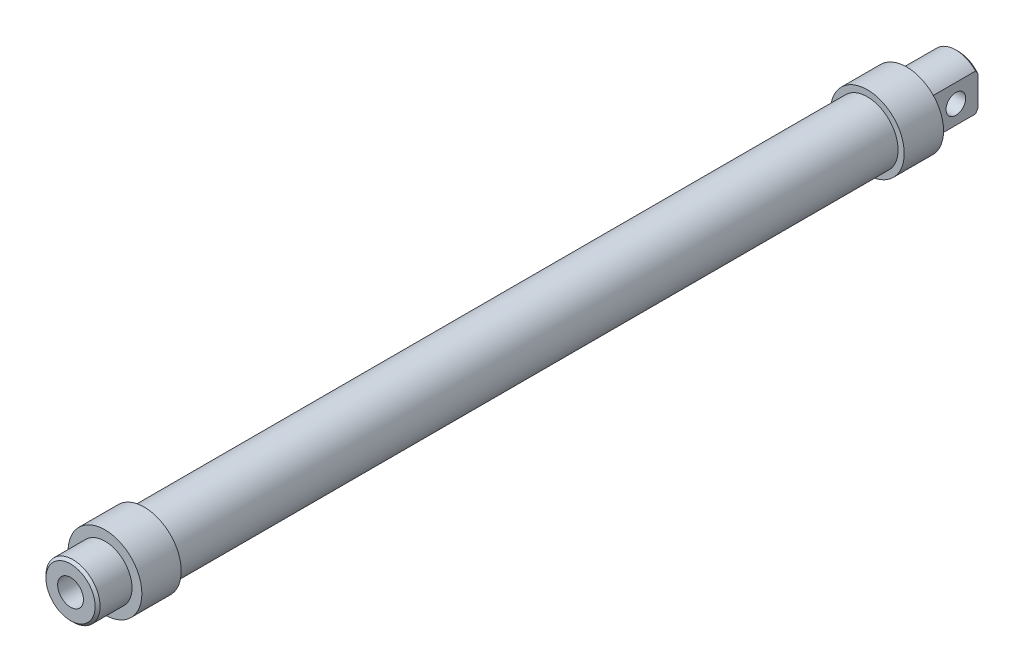
ISO-10303-21;
HEADER;
FILE_DESCRIPTION(('STEP AP214'),'2;1');
FILE_NAME('part.step','',(''),(''),'','','');
FILE_SCHEMA(('AUTOMOTIVE_DESIGN { 1 0 10303 214 1 1 1 1 }'));
ENDSEC;
DATA;
#1=APPLICATION_CONTEXT('core data for automotive mechanical design processes');
#2=APPLICATION_PROTOCOL_DEFINITION('international standard','automotive_design',2000,#1);
#3=PRODUCT_CONTEXT('',#1,'mechanical');
#4=PRODUCT('Part','Part','',(#3));
#5=PRODUCT_RELATED_PRODUCT_CATEGORY('part','',(#4));
#6=PRODUCT_DEFINITION_FORMATION('','',#4);
#7=PRODUCT_DEFINITION_CONTEXT('part definition',#1,'design');
#8=PRODUCT_DEFINITION('design','',#6,#7);
#9=PRODUCT_DEFINITION_SHAPE('','',#8);
#10=(LENGTH_UNIT() NAMED_UNIT(*) SI_UNIT(.MILLI.,.METRE.));
#11=(NAMED_UNIT(*) PLANE_ANGLE_UNIT() SI_UNIT($,.RADIAN.));
#12=(NAMED_UNIT(*) SI_UNIT($,.STERADIAN.) SOLID_ANGLE_UNIT());
#13=UNCERTAINTY_MEASURE_WITH_UNIT(LENGTH_MEASURE(1.E-05),#10,'distance_accuracy_value','');
#14=(GEOMETRIC_REPRESENTATION_CONTEXT(3) GLOBAL_UNCERTAINTY_ASSIGNED_CONTEXT((#13)) GLOBAL_UNIT_ASSIGNED_CONTEXT((#10,
#11,#12)) REPRESENTATION_CONTEXT('',''));
#15=CARTESIAN_POINT('',(0.,0.,0.));
#16=DIRECTION('',(0.,0.,1.));
#17=DIRECTION('',(1.,0.,0.));
#18=AXIS2_PLACEMENT_3D('',#15,#16,#17);
#19=CARTESIAN_POINT('',(0.,0.,326.));
#20=DIRECTION('',(0.,0.,-1.));
#21=DIRECTION('',(-1.,0.,0.));
#22=AXIS2_PLACEMENT_3D('',#19,#20,#21);
#23=CYLINDRICAL_SURFACE('',#22,12.5);
#24=CARTESIAN_POINT('',(0.,0.,16.));
#25=DIRECTION('',(0.,0.,1.));
#26=DIRECTION('',(1.,0.,0.));
#27=AXIS2_PLACEMENT_3D('',#24,#25,#26);
#28=CIRCLE('',#27,12.5);
#29=CARTESIAN_POINT('',(12.5,0.,16.));
#30=VERTEX_POINT('',#29);
#31=EDGE_CURVE('E300',#30,#30,#28,.T.);
#32=ORIENTED_EDGE('',*,*,#31,.T.);
#33=EDGE_LOOP('',(#32));
#34=FACE_BOUND('',#33,.T.);
#35=CARTESIAN_POINT('',(0.,0.,310.));
#36=DIRECTION('',(0.,0.,1.));
#37=DIRECTION('',(1.,0.,0.));
#38=AXIS2_PLACEMENT_3D('',#35,#36,#37);
#39=CIRCLE('',#38,12.5);
#40=CARTESIAN_POINT('',(12.5,0.,310.));
#41=VERTEX_POINT('',#40);
#42=EDGE_CURVE('E306',#41,#41,#39,.T.);
#43=ORIENTED_EDGE('',*,*,#42,.F.);
#44=EDGE_LOOP('',(#43));
#45=FACE_BOUND('',#44,.T.);
#46=ADVANCED_FACE('F33',(#34,#45),#23,.T.);
#47=CARTESIAN_POINT('',(0.,0.,310.));
#48=DIRECTION('',(0.,0.,1.));
#49=DIRECTION('',(1.,0.,0.));
#50=AXIS2_PLACEMENT_3D('',#47,#48,#49);
#51=CYLINDRICAL_SURFACE('',#50,15.);
#52=CARTESIAN_POINT('',(0.,0.,310.));
#53=DIRECTION('',(0.,0.,1.));
#54=DIRECTION('',(1.,0.,0.));
#55=AXIS2_PLACEMENT_3D('',#52,#53,#54);
#56=CIRCLE('',#55,15.);
#57=CARTESIAN_POINT('',(15.,0.,310.));
#58=VERTEX_POINT('',#57);
#59=EDGE_CURVE('E303',#58,#58,#56,.T.);
#60=ORIENTED_EDGE('',*,*,#59,.T.);
#61=EDGE_LOOP('',(#60));
#62=FACE_BOUND('',#61,.T.);
#63=CARTESIAN_POINT('',(0.,0.,326.));
#64=DIRECTION('',(0.,0.,1.));
#65=DIRECTION('',(1.,0.,0.));
#66=AXIS2_PLACEMENT_3D('',#63,#64,#65);
#67=CIRCLE('',#66,15.);
#68=CARTESIAN_POINT('',(15.,0.,326.));
#69=VERTEX_POINT('',#68);
#70=EDGE_CURVE('E307',#69,#69,#67,.T.);
#71=ORIENTED_EDGE('',*,*,#70,.F.);
#72=EDGE_LOOP('',(#71));
#73=FACE_BOUND('',#72,.T.);
#74=ADVANCED_FACE('F190',(#62,#73),#51,.T.);
#75=CARTESIAN_POINT('',(0.,0.,310.));
#76=DIRECTION('',(0.,0.,1.));
#77=DIRECTION('',(1.,0.,0.));
#78=AXIS2_PLACEMENT_3D('',#75,#76,#77);
#79=PLANE('',#78);
#80=ORIENTED_EDGE('',*,*,#42,.T.);
#81=EDGE_LOOP('',(#80));
#82=FACE_BOUND('',#81,.T.);
#83=ORIENTED_EDGE('',*,*,#59,.F.);
#84=EDGE_LOOP('',(#83));
#85=FACE_BOUND('',#84,.T.);
#86=ADVANCED_FACE('F201',(#82,#85),#79,.F.);
#87=CARTESIAN_POINT('',(0.,0.,326.));
#88=DIRECTION('',(0.,0.,1.));
#89=DIRECTION('',(1.,0.,0.));
#90=AXIS2_PLACEMENT_3D('',#87,#88,#89);
#91=PLANE('',#90);
#92=CARTESIAN_POINT('',(0.,0.,326.));
#93=DIRECTION('',(0.,0.,1.));
#94=DIRECTION('',(1.,0.,0.));
#95=AXIS2_PLACEMENT_3D('',#92,#93,#94);
#96=CIRCLE('',#95,11.);
#97=CARTESIAN_POINT('',(11.,0.,326.));
#98=VERTEX_POINT('',#97);
#99=EDGE_CURVE('E328',#98,#98,#96,.T.);
#100=ORIENTED_EDGE('',*,*,#99,.F.);
#101=EDGE_LOOP('',(#100));
#102=FACE_BOUND('',#101,.T.);
#103=ORIENTED_EDGE('',*,*,#70,.T.);
#104=EDGE_LOOP('',(#103));
#105=FACE_BOUND('',#104,.T.);
#106=ADVANCED_FACE('F197',(#102,#105),#91,.T.);
#107=CARTESIAN_POINT('',(0.,0.,16.));
#108=DIRECTION('',(0.,0.,-1.));
#109=DIRECTION('',(-1.,0.,0.));
#110=AXIS2_PLACEMENT_3D('',#107,#108,#109);
#111=CYLINDRICAL_SURFACE('',#110,15.);
#112=CARTESIAN_POINT('',(0.,0.,16.));
#113=DIRECTION('',(0.,0.,1.));
#114=DIRECTION('',(1.,0.,0.));
#115=AXIS2_PLACEMENT_3D('',#112,#113,#114);
#116=CIRCLE('',#115,15.);
#117=CARTESIAN_POINT('',(15.,0.,16.));
#118=VERTEX_POINT('',#117);
#119=EDGE_CURVE('E297',#118,#118,#116,.T.);
#120=ORIENTED_EDGE('',*,*,#119,.F.);
#121=EDGE_LOOP('',(#120));
#122=FACE_BOUND('',#121,.T.);
#123=CARTESIAN_POINT('',(0.,0.,0.));
#124=DIRECTION('',(0.,0.,1.));
#125=DIRECTION('',(1.,0.,0.));
#126=AXIS2_PLACEMENT_3D('',#123,#124,#125);
#127=CIRCLE('',#126,15.);
#128=CARTESIAN_POINT('',(15.,0.,0.));
#129=VERTEX_POINT('',#128);
#130=EDGE_CURVE('E296',#129,#129,#127,.T.);
#131=ORIENTED_EDGE('',*,*,#130,.T.);
#132=EDGE_LOOP('',(#131));
#133=FACE_BOUND('',#132,.T.);
#134=ADVANCED_FACE('F200',(#122,#133),#111,.T.);
#135=CARTESIAN_POINT('',(0.,0.,16.));
#136=DIRECTION('',(0.,0.,1.));
#137=DIRECTION('',(1.,0.,0.));
#138=AXIS2_PLACEMENT_3D('',#135,#136,#137);
#139=PLANE('',#138);
#140=ORIENTED_EDGE('',*,*,#31,.F.);
#141=EDGE_LOOP('',(#140));
#142=FACE_BOUND('',#141,.T.);
#143=ORIENTED_EDGE('',*,*,#119,.T.);
#144=EDGE_LOOP('',(#143));
#145=FACE_BOUND('',#144,.T.);
#146=ADVANCED_FACE('F195',(#142,#145),#139,.T.);
#147=CARTESIAN_POINT('',(0.,0.,0.));
#148=DIRECTION('',(0.,0.,1.));
#149=DIRECTION('',(1.,0.,0.));
#150=AXIS2_PLACEMENT_3D('',#147,#148,#149);
#151=PLANE('',#150);
#152=CARTESIAN_POINT('',(0.,0.,0.));
#153=DIRECTION('',(0.,0.,1.));
#154=DIRECTION('',(1.,0.,0.));
#155=AXIS2_PLACEMENT_3D('',#152,#153,#154);
#156=CIRCLE('',#155,11.);
#157=CARTESIAN_POINT('',(11.,0.,0.));
#158=VERTEX_POINT('',#157);
#159=EDGE_CURVE('E233',#158,#158,#156,.F.);
#160=ORIENTED_EDGE('',*,*,#159,.F.);
#161=EDGE_LOOP('',(#160));
#162=FACE_BOUND('',#161,.T.);
#163=ORIENTED_EDGE('',*,*,#130,.F.);
#164=EDGE_LOOP('',(#163));
#165=FACE_BOUND('',#164,.T.);
#166=ADVANCED_FACE('F192',(#162,#165),#151,.F.);
#167=CARTESIAN_POINT('',(0.,0.,-21.));
#168=DIRECTION('',(0.,0.,1.));
#169=DIRECTION('',(1.,0.,0.));
#170=AXIS2_PLACEMENT_3D('',#167,#168,#169);
#171=CYLINDRICAL_SURFACE('',#170,11.);
#172=DIRECTION('',(0.,0.,1.));
#173=VECTOR('',#172,1.);
#174=CARTESIAN_POINT('',(-8.,-7.54983443527075,-21.));
#175=LINE('',#174,#173);
#176=CARTESIAN_POINT('',(-8.,-7.54983443527075,-3.00000000000001));
#177=VERTEX_POINT('',#176);
#178=CARTESIAN_POINT('',(-8.,-7.54983443527075,-20.0000000000002));
#179=VERTEX_POINT('',#178);
#180=EDGE_CURVE('E258',#177,#179,#175,.F.);
#181=ORIENTED_EDGE('',*,*,#180,.T.);
#182=CARTESIAN_POINT('',(0.,0.,-20.0000000000002));
#183=DIRECTION('',(0.,0.,-1.));
#184=DIRECTION('',(-1.,0.,0.));
#185=AXIS2_PLACEMENT_3D('',#182,#183,#184);
#186=CIRCLE('',#185,11.);
#187=CARTESIAN_POINT('',(8.,-7.54983443527075,-20.0000000000002));
#188=VERTEX_POINT('',#187);
#189=EDGE_CURVE('E56',#179,#188,#186,.F.);
#190=ORIENTED_EDGE('',*,*,#189,.T.);
#191=DIRECTION('',(0.,0.,1.));
#192=VECTOR('',#191,1.);
#193=CARTESIAN_POINT('',(8.,-7.54983443527075,-21.));
#194=LINE('',#193,#192);
#195=CARTESIAN_POINT('',(8.,-7.54983443527075,-3.00000000000001));
#196=VERTEX_POINT('',#195);
#197=EDGE_CURVE('E248',#188,#196,#194,.T.);
#198=ORIENTED_EDGE('',*,*,#197,.T.);
#199=CARTESIAN_POINT('',(0.,0.,-11.));
#200=DIRECTION('',(0.707106781186547,0.,-0.707106781186547));
#201=DIRECTION('',(0.707106781186548,0.,0.707106781186548));
#202=AXIS2_PLACEMENT_3D('',#199,#200,#201);
#203=ELLIPSE('',#202,15.556349186104,11.);
#204=CARTESIAN_POINT('',(9.,-6.32455532033676,-2.));
#205=VERTEX_POINT('',#204);
#206=EDGE_CURVE('E11',#196,#205,#203,.F.);
#207=ORIENTED_EDGE('',*,*,#206,.T.);
#208=CARTESIAN_POINT('',(0.,0.,-2.));
#209=DIRECTION('',(0.,0.,1.));
#210=DIRECTION('',(1.,0.,0.));
#211=AXIS2_PLACEMENT_3D('',#208,#209,#210);
#212=CIRCLE('',#211,11.);
#213=CARTESIAN_POINT('',(9.,6.32455532033676,-2.));
#214=VERTEX_POINT('',#213);
#215=EDGE_CURVE('E232',#205,#214,#212,.T.);
#216=ORIENTED_EDGE('',*,*,#215,.T.);
#217=CARTESIAN_POINT('',(0.,0.,-11.));
#218=DIRECTION('',(0.707106781186547,0.,-0.707106781186547));
#219=DIRECTION('',(0.707106781186548,0.,0.707106781186548));
#220=AXIS2_PLACEMENT_3D('',#217,#218,#219);
#221=ELLIPSE('',#220,15.556349186104,11.);
#222=CARTESIAN_POINT('',(8.,7.54983443527075,-3.00000000000001));
#223=VERTEX_POINT('',#222);
#224=EDGE_CURVE('E42',#214,#223,#221,.F.);
#225=ORIENTED_EDGE('',*,*,#224,.T.);
#226=DIRECTION('',(0.,0.,1.));
#227=VECTOR('',#226,1.);
#228=CARTESIAN_POINT('',(8.,7.54983443527075,-21.));
#229=LINE('',#228,#227);
#230=CARTESIAN_POINT('',(8.,7.54983443527075,-20.0000000000002));
#231=VERTEX_POINT('',#230);
#232=EDGE_CURVE('E243',#223,#231,#229,.F.);
#233=ORIENTED_EDGE('',*,*,#232,.T.);
#234=CARTESIAN_POINT('',(0.,0.,-20.0000000000002));
#235=DIRECTION('',(0.,0.,-1.));
#236=DIRECTION('',(-1.,0.,0.));
#237=AXIS2_PLACEMENT_3D('',#234,#235,#236);
#238=CIRCLE('',#237,11.);
#239=CARTESIAN_POINT('',(-8.,7.54983443527075,-20.0000000000002));
#240=VERTEX_POINT('',#239);
#241=EDGE_CURVE('E236',#231,#240,#238,.F.);
#242=ORIENTED_EDGE('',*,*,#241,.T.);
#243=DIRECTION('',(0.,0.,1.));
#244=VECTOR('',#243,1.);
#245=CARTESIAN_POINT('',(-8.,7.54983443527075,-21.));
#246=LINE('',#245,#244);
#247=CARTESIAN_POINT('',(-8.,7.54983443527075,-3.00000000000001));
#248=VERTEX_POINT('',#247);
#249=EDGE_CURVE('E106',#240,#248,#246,.T.);
#250=ORIENTED_EDGE('',*,*,#249,.T.);
#251=CARTESIAN_POINT('',(0.,0.,-11.));
#252=DIRECTION('',(-0.707106781186547,0.,-0.707106781186547));
#253=DIRECTION('',(-0.707106781186548,0.,0.707106781186548));
#254=AXIS2_PLACEMENT_3D('',#251,#252,#253);
#255=ELLIPSE('',#254,15.556349186104,11.);
#256=CARTESIAN_POINT('',(-9.,6.32455532033676,-2.));
#257=VERTEX_POINT('',#256);
#258=EDGE_CURVE('E100',#248,#257,#255,.F.);
#259=ORIENTED_EDGE('',*,*,#258,.T.);
#260=CARTESIAN_POINT('',(0.,0.,-2.));
#261=DIRECTION('',(0.,0.,1.));
#262=DIRECTION('',(1.,0.,0.));
#263=AXIS2_PLACEMENT_3D('',#260,#261,#262);
#264=CIRCLE('',#263,11.);
#265=CARTESIAN_POINT('',(-9.,-6.32455532033676,-2.));
#266=VERTEX_POINT('',#265);
#267=EDGE_CURVE('E104',#257,#266,#264,.T.);
#268=ORIENTED_EDGE('',*,*,#267,.T.);
#269=CARTESIAN_POINT('',(0.,0.,-11.));
#270=DIRECTION('',(-0.707106781186547,0.,-0.707106781186547));
#271=DIRECTION('',(-0.707106781186548,0.,0.707106781186548));
#272=AXIS2_PLACEMENT_3D('',#269,#270,#271);
#273=ELLIPSE('',#272,15.556349186104,11.);
#274=EDGE_CURVE('E110',#266,#177,#273,.F.);
#275=ORIENTED_EDGE('',*,*,#274,.T.);
#276=EDGE_LOOP('',(#181,#190,#198,#207,#216,#225,#233,#242,#250,#259,#268,#275));
#277=FACE_BOUND('',#276,.T.);
#278=ORIENTED_EDGE('',*,*,#159,.T.);
#279=EDGE_LOOP('',(#278));
#280=FACE_BOUND('',#279,.T.);
#281=ADVANCED_FACE('F102',(#277,#280),#171,.T.);
#282=CARTESIAN_POINT('',(0.,0.,-21.));
#283=DIRECTION('',(0.,0.,-1.));
#284=DIRECTION('',(-1.,0.,0.));
#285=AXIS2_PLACEMENT_3D('',#282,#283,#284);
#286=PLANE('',#285);
#287=DIRECTION('',(0.,1.,0.));
#288=VECTOR('',#287,1.);
#289=CARTESIAN_POINT('',(8.,0.,-21.));
#290=LINE('',#289,#288);
#291=CARTESIAN_POINT('',(8.,-6.00000000000029,-21.));
#292=VERTEX_POINT('',#291);
#293=CARTESIAN_POINT('',(8.,6.00000000000029,-21.));
#294=VERTEX_POINT('',#293);
#295=EDGE_CURVE('E225',#292,#294,#290,.T.);
#296=ORIENTED_EDGE('',*,*,#295,.F.);
#297=CARTESIAN_POINT('',(0.,0.,-21.));
#298=DIRECTION('',(0.,0.,-1.));
#299=DIRECTION('',(-1.,0.,0.));
#300=AXIS2_PLACEMENT_3D('',#297,#298,#299);
#301=CIRCLE('',#300,10.0000000000002);
#302=CARTESIAN_POINT('',(-8.,-6.00000000000029,-21.));
#303=VERTEX_POINT('',#302);
#304=EDGE_CURVE('E228',#292,#303,#301,.T.);
#305=ORIENTED_EDGE('',*,*,#304,.T.);
#306=DIRECTION('',(0.,-1.,0.));
#307=VECTOR('',#306,1.);
#308=CARTESIAN_POINT('',(-8.,0.,-21.));
#309=LINE('',#308,#307);
#310=CARTESIAN_POINT('',(-8.,6.00000000000029,-21.));
#311=VERTEX_POINT('',#310);
#312=EDGE_CURVE('E117',#311,#303,#309,.T.);
#313=ORIENTED_EDGE('',*,*,#312,.F.);
#314=CARTESIAN_POINT('',(0.,0.,-21.));
#315=DIRECTION('',(0.,0.,-1.));
#316=DIRECTION('',(-1.,0.,0.));
#317=AXIS2_PLACEMENT_3D('',#314,#315,#316);
#318=CIRCLE('',#317,10.0000000000002);
#319=EDGE_CURVE('E231',#311,#294,#318,.T.);
#320=ORIENTED_EDGE('',*,*,#319,.T.);
#321=EDGE_LOOP('',(#296,#305,#313,#320));
#322=FACE_BOUND('',#321,.T.);
#323=ADVANCED_FACE('F150',(#322),#286,.T.);
#324=CARTESIAN_POINT('',(0.,0.,-2.));
#325=DIRECTION('',(0.,0.,1.));
#326=DIRECTION('',(1.,0.,0.));
#327=AXIS2_PLACEMENT_3D('',#324,#325,#326);
#328=PLANE('',#327);
#329=ORIENTED_EDGE('',*,*,#215,.F.);
#330=DIRECTION('',(0.,1.,0.));
#331=VECTOR('',#330,1.);
#332=CARTESIAN_POINT('',(9.,7.54983443527075,-2.));
#333=LINE('',#332,#331);
#334=EDGE_CURVE('E251',#205,#214,#333,.T.);
#335=ORIENTED_EDGE('',*,*,#334,.T.);
#336=EDGE_LOOP('',(#329,#335));
#337=FACE_BOUND('',#336,.T.);
#338=ADVANCED_FACE('F145',(#337),#328,.F.);
#339=CARTESIAN_POINT('',(8.,11.,-2.));
#340=DIRECTION('',(-1.,0.,0.));
#341=DIRECTION('',(0.,0.,1.));
#342=AXIS2_PLACEMENT_3D('',#339,#340,#341);
#343=PLANE('',#342);
#344=CARTESIAN_POINT('',(8.,0.,-12.));
#345=DIRECTION('',(1.,0.,0.));
#346=DIRECTION('',(0.,0.,-1.));
#347=AXIS2_PLACEMENT_3D('',#344,#345,#346);
#348=CIRCLE('',#347,4.);
#349=CARTESIAN_POINT('',(8.,0.,-16.));
#350=VERTEX_POINT('',#349);
#351=EDGE_CURVE('E259',#350,#350,#348,.T.);
#352=ORIENTED_EDGE('',*,*,#351,.F.);
#353=EDGE_LOOP('',(#352));
#354=FACE_BOUND('',#353,.T.);
#355=ORIENTED_EDGE('',*,*,#232,.F.);
#356=DIRECTION('',(0.,-1.,0.));
#357=VECTOR('',#356,1.);
#358=CARTESIAN_POINT('',(8.,-7.54983443527075,-3.));
#359=LINE('',#358,#357);
#360=EDGE_CURVE('E49',#223,#196,#359,.T.);
#361=ORIENTED_EDGE('',*,*,#360,.T.);
#362=ORIENTED_EDGE('',*,*,#197,.F.);
#363=CARTESIAN_POINT('',(8.,-7.54983443527075,-20.0000000000002));
#364=CARTESIAN_POINT('',(8.,-7.42307498885665,-20.0869963125484));
#365=CARTESIAN_POINT('',(8.,-7.29577699636155,-20.1732130100136));
#366=CARTESIAN_POINT('',(8.,-7.04004008388865,-20.3438716550154));
#367=CARTESIAN_POINT('',(8.,-6.91160143499432,-20.4283140089835));
#368=CARTESIAN_POINT('',(8.,-6.65345638848832,-20.5952517431701));
#369=CARTESIAN_POINT('',(8.,-6.52374994825773,-20.6777470576151));
#370=CARTESIAN_POINT('',(8.,-6.26294077728652,-20.8405669855693));
#371=CARTESIAN_POINT('',(8.,-6.1318377298956,-20.9208910915446));
#372=CARTESIAN_POINT('',(8.,-6.00000000000029,-21.));
#373=B_SPLINE_CURVE_WITH_KNOTS('',3,(#363,#364,#365,#366,#367,#368,#369,#370,#371,#372),
.UNSPECIFIED.,.F.,.F.,(4,2,2,2,4),(0.,0.461224403244247,0.922341980544465,1.38347511275868,
1.84471512163532),.UNSPECIFIED.);
#374=EDGE_CURVE('E165',#188,#292,#373,.T.);
#375=ORIENTED_EDGE('',*,*,#374,.T.);
#376=ORIENTED_EDGE('',*,*,#295,.T.);
#377=CARTESIAN_POINT('',(8.,6.00000000000029,-21.));
#378=CARTESIAN_POINT('',(8.,6.1318377298956,-20.9208910915446));
#379=CARTESIAN_POINT('',(8.,6.26294077728652,-20.8405669855693));
#380=CARTESIAN_POINT('',(8.,6.52374994825773,-20.6777470576151));
#381=CARTESIAN_POINT('',(8.,6.65345638848832,-20.5952517431701));
#382=CARTESIAN_POINT('',(8.,6.91160143499432,-20.4283140089835));
#383=CARTESIAN_POINT('',(8.,7.04004008388865,-20.3438716550154));
#384=CARTESIAN_POINT('',(8.,7.29577699636155,-20.1732130100136));
#385=CARTESIAN_POINT('',(8.,7.42307498885665,-20.0869963125484));
#386=CARTESIAN_POINT('',(8.,7.54983443527075,-20.0000000000002));
#387=B_SPLINE_CURVE_WITH_KNOTS('',3,(#377,#378,#379,#380,#381,#382,#383,#384,#385,#386),
.UNSPECIFIED.,.F.,.F.,(4,2,2,2,4),(0.,0.461240008876638,0.922373141090855,1.38349071839107,
1.84471512163532),.UNSPECIFIED.);
#388=EDGE_CURVE('E159',#294,#231,#387,.T.);
#389=ORIENTED_EDGE('',*,*,#388,.T.);
#390=EDGE_LOOP('',(#355,#361,#362,#375,#376,#389));
#391=FACE_BOUND('',#390,.T.);
#392=ADVANCED_FACE('F149',(#354,#391),#343,.F.);
#393=CARTESIAN_POINT('',(0.,0.,-2.));
#394=DIRECTION('',(0.,0.,1.));
#395=DIRECTION('',(1.,0.,0.));
#396=AXIS2_PLACEMENT_3D('',#393,#394,#395);
#397=PLANE('',#396);
#398=ORIENTED_EDGE('',*,*,#267,.F.);
#399=DIRECTION('',(0.,-1.,0.));
#400=VECTOR('',#399,1.);
#401=CARTESIAN_POINT('',(-9.,-7.54983443527075,-2.));
#402=LINE('',#401,#400);
#403=EDGE_CURVE('E115',#257,#266,#402,.T.);
#404=ORIENTED_EDGE('',*,*,#403,.T.);
#405=EDGE_LOOP('',(#398,#404));
#406=FACE_BOUND('',#405,.T.);
#407=ADVANCED_FACE('F114',(#406),#397,.F.);
#408=CARTESIAN_POINT('',(-8.,11.,-2.));
#409=DIRECTION('',(1.,0.,0.));
#410=DIRECTION('',(0.,0.,-1.));
#411=AXIS2_PLACEMENT_3D('',#408,#409,#410);
#412=PLANE('',#411);
#413=CARTESIAN_POINT('',(-8.,0.,-12.));
#414=DIRECTION('',(1.,0.,0.));
#415=DIRECTION('',(0.,0.,-1.));
#416=AXIS2_PLACEMENT_3D('',#413,#414,#415);
#417=CIRCLE('',#416,4.);
#418=CARTESIAN_POINT('',(-8.,0.,-16.));
#419=VERTEX_POINT('',#418);
#420=EDGE_CURVE('E256',#419,#419,#417,.T.);
#421=ORIENTED_EDGE('',*,*,#420,.T.);
#422=EDGE_LOOP('',(#421));
#423=FACE_BOUND('',#422,.T.);
#424=ORIENTED_EDGE('',*,*,#180,.F.);
#425=DIRECTION('',(0.,1.,0.));
#426=VECTOR('',#425,1.);
#427=CARTESIAN_POINT('',(-8.,7.54983443527075,-3.));
#428=LINE('',#427,#426);
#429=EDGE_CURVE('E289',#177,#248,#428,.T.);
#430=ORIENTED_EDGE('',*,*,#429,.T.);
#431=ORIENTED_EDGE('',*,*,#249,.F.);
#432=CARTESIAN_POINT('',(-8.,7.54983443527075,-20.0000000000002));
#433=CARTESIAN_POINT('',(-8.,7.42307498885665,-20.0869963125484));
#434=CARTESIAN_POINT('',(-8.,7.29577699636155,-20.1732130100136));
#435=CARTESIAN_POINT('',(-8.,7.04004008388865,-20.3438716550154));
#436=CARTESIAN_POINT('',(-8.,6.91160143499432,-20.4283140089835));
#437=CARTESIAN_POINT('',(-8.,6.65345638848832,-20.5952517431701));
#438=CARTESIAN_POINT('',(-8.,6.52374994825773,-20.6777470576151));
#439=CARTESIAN_POINT('',(-8.,6.26294077728652,-20.8405669855693));
#440=CARTESIAN_POINT('',(-8.,6.1318377298956,-20.9208910915446));
#441=CARTESIAN_POINT('',(-8.,6.00000000000029,-21.));
#442=B_SPLINE_CURVE_WITH_KNOTS('',3,(#432,#433,#434,#435,#436,#437,#438,#439,#440,#441),
.UNSPECIFIED.,.F.,.F.,(4,2,2,2,4),(0.,0.461224403244247,0.922341980544465,1.38347511275868,
1.84471512163532),.UNSPECIFIED.);
#443=EDGE_CURVE('E120',#240,#311,#442,.T.);
#444=ORIENTED_EDGE('',*,*,#443,.T.);
#445=ORIENTED_EDGE('',*,*,#312,.T.);
#446=CARTESIAN_POINT('',(-8.,-6.00000000000029,-21.));
#447=CARTESIAN_POINT('',(-8.,-6.1318377298956,-20.9208910915446));
#448=CARTESIAN_POINT('',(-8.,-6.26294077728652,-20.8405669855693));
#449=CARTESIAN_POINT('',(-8.,-6.52374994825773,-20.6777470576151));
#450=CARTESIAN_POINT('',(-8.,-6.65345638848832,-20.5952517431701));
#451=CARTESIAN_POINT('',(-8.,-6.91160143499432,-20.4283140089835));
#452=CARTESIAN_POINT('',(-8.,-7.04004008388865,-20.3438716550154));
#453=CARTESIAN_POINT('',(-8.,-7.29577699636155,-20.1732130100136));
#454=CARTESIAN_POINT('',(-8.,-7.42307498885665,-20.0869963125484));
#455=CARTESIAN_POINT('',(-8.,-7.54983443527075,-20.0000000000002));
#456=B_SPLINE_CURVE_WITH_KNOTS('',3,(#446,#447,#448,#449,#450,#451,#452,#453,#454,#455),
.UNSPECIFIED.,.F.,.F.,(4,2,2,2,4),(0.,0.461240008876638,0.922373141090855,1.38349071839107,
1.84471512163532),.UNSPECIFIED.);
#457=EDGE_CURVE('E123',#303,#179,#456,.T.);
#458=ORIENTED_EDGE('',*,*,#457,.T.);
#459=EDGE_LOOP('',(#424,#430,#431,#444,#445,#458));
#460=FACE_BOUND('',#459,.T.);
#461=ADVANCED_FACE('F137',(#423,#460),#412,.F.);
#462=CARTESIAN_POINT('',(-15.,0.,-12.));
#463=DIRECTION('',(1.,0.,0.));
#464=DIRECTION('',(0.,0.,-1.));
#465=AXIS2_PLACEMENT_3D('',#462,#463,#464);
#466=CYLINDRICAL_SURFACE('',#465,4.);
#467=ORIENTED_EDGE('',*,*,#351,.T.);
#468=EDGE_LOOP('',(#467));
#469=FACE_BOUND('',#468,.T.);
#470=ORIENTED_EDGE('',*,*,#420,.F.);
#471=EDGE_LOOP('',(#470));
#472=FACE_BOUND('',#471,.T.);
#473=ADVANCED_FACE('F142',(#469,#472),#466,.F.);
#474=CARTESIAN_POINT('',(0.,0.,340.));
#475=DIRECTION('',(0.,0.,-1.));
#476=DIRECTION('',(-1.,0.,0.));
#477=AXIS2_PLACEMENT_3D('',#474,#475,#476);
#478=CYLINDRICAL_SURFACE('',#477,11.);
#479=CARTESIAN_POINT('',(0.,0.,339.));
#480=DIRECTION('',(0.,0.,1.));
#481=DIRECTION('',(1.,0.,0.));
#482=AXIS2_PLACEMENT_3D('',#479,#480,#481);
#483=CIRCLE('',#482,11.);
#484=CARTESIAN_POINT('',(11.,0.,339.));
#485=VERTEX_POINT('',#484);
#486=EDGE_CURVE('E121',#485,#485,#483,.F.);
#487=ORIENTED_EDGE('',*,*,#486,.T.);
#488=EDGE_LOOP('',(#487));
#489=FACE_BOUND('',#488,.T.);
#490=ORIENTED_EDGE('',*,*,#99,.T.);
#491=EDGE_LOOP('',(#490));
#492=FACE_BOUND('',#491,.T.);
#493=ADVANCED_FACE('F265',(#489,#492),#478,.T.);
#494=CARTESIAN_POINT('',(0.,0.,340.));
#495=DIRECTION('',(0.,0.,1.));
#496=DIRECTION('',(1.,0.,0.));
#497=AXIS2_PLACEMENT_3D('',#494,#495,#496);
#498=PLANE('',#497);
#499=CARTESIAN_POINT('',(0.,0.,340.));
#500=DIRECTION('',(0.,0.,1.));
#501=DIRECTION('',(1.,0.,0.));
#502=AXIS2_PLACEMENT_3D('',#499,#500,#501);
#503=CIRCLE('',#502,5.25);
#504=CARTESIAN_POINT('',(5.25,0.,340.));
#505=VERTEX_POINT('',#504);
#506=EDGE_CURVE('E332',#505,#505,#503,.T.);
#507=ORIENTED_EDGE('',*,*,#506,.F.);
#508=EDGE_LOOP('',(#507));
#509=FACE_BOUND('',#508,.T.);
#510=CARTESIAN_POINT('',(0.,0.,340.));
#511=DIRECTION('',(0.,0.,1.));
#512=DIRECTION('',(1.,0.,0.));
#513=AXIS2_PLACEMENT_3D('',#510,#511,#512);
#514=CIRCLE('',#513,10.0000000000001);
#515=CARTESIAN_POINT('',(10.0000000000001,0.,340.));
#516=VERTEX_POINT('',#515);
#517=EDGE_CURVE('E116',#516,#516,#514,.T.);
#518=ORIENTED_EDGE('',*,*,#517,.T.);
#519=EDGE_LOOP('',(#518));
#520=FACE_BOUND('',#519,.T.);
#521=ADVANCED_FACE('F186',(#509,#520),#498,.T.);
#522=CARTESIAN_POINT('',(0.,0.,340.));
#523=DIRECTION('',(0.,0.,-1.));
#524=DIRECTION('',(-1.,0.,0.));
#525=AXIS2_PLACEMENT_3D('',#522,#523,#524);
#526=CONICAL_SURFACE('',#525,10.0000000000001,0.785398163397443);
#527=ORIENTED_EDGE('',*,*,#486,.F.);
#528=EDGE_LOOP('',(#527));
#529=FACE_BOUND('',#528,.T.);
#530=ORIENTED_EDGE('',*,*,#517,.F.);
#531=EDGE_LOOP('',(#530));
#532=FACE_BOUND('',#531,.T.);
#533=ADVANCED_FACE('F183',(#529,#532),#526,.T.);
#534=CARTESIAN_POINT('',(-9.,0.,-2.));
#535=DIRECTION('',(-0.707106781186547,0.,-0.707106781186547));
#536=DIRECTION('',(0.,1.,0.));
#537=AXIS2_PLACEMENT_3D('',#534,#535,#536);
#538=PLANE('',#537);
#539=ORIENTED_EDGE('',*,*,#258,.F.);
#540=ORIENTED_EDGE('',*,*,#429,.F.);
#541=ORIENTED_EDGE('',*,*,#274,.F.);
#542=ORIENTED_EDGE('',*,*,#403,.F.);
#543=EDGE_LOOP('',(#539,#540,#541,#542));
#544=FACE_BOUND('',#543,.T.);
#545=ADVANCED_FACE('F119',(#544),#538,.T.);
#546=CARTESIAN_POINT('',(9.,0.,-2.));
#547=DIRECTION('',(0.707106781186547,0.,-0.707106781186547));
#548=DIRECTION('',(0.,-1.,0.));
#549=AXIS2_PLACEMENT_3D('',#546,#547,#548);
#550=PLANE('',#549);
#551=ORIENTED_EDGE('',*,*,#206,.F.);
#552=ORIENTED_EDGE('',*,*,#360,.F.);
#553=ORIENTED_EDGE('',*,*,#224,.F.);
#554=ORIENTED_EDGE('',*,*,#334,.F.);
#555=EDGE_LOOP('',(#551,#552,#553,#554));
#556=FACE_BOUND('',#555,.T.);
#557=ADVANCED_FACE('F175',(#556),#550,.T.);
#558=CARTESIAN_POINT('',(0.,0.,-21.));
#559=DIRECTION('',(0.,0.,1.));
#560=DIRECTION('',(1.,0.,0.));
#561=AXIS2_PLACEMENT_3D('',#558,#559,#560);
#562=CONICAL_SURFACE('',#561,10.0000000000002,0.785398163397458);
#563=ORIENTED_EDGE('',*,*,#374,.F.);
#564=ORIENTED_EDGE('',*,*,#189,.F.);
#565=ORIENTED_EDGE('',*,*,#457,.F.);
#566=ORIENTED_EDGE('',*,*,#304,.F.);
#567=EDGE_LOOP('',(#563,#564,#565,#566));
#568=FACE_BOUND('',#567,.T.);
#569=ADVANCED_FACE('F171',(#568),#562,.T.);
#570=CARTESIAN_POINT('',(0.,0.,-21.));
#571=DIRECTION('',(0.,0.,1.));
#572=DIRECTION('',(1.,0.,0.));
#573=AXIS2_PLACEMENT_3D('',#570,#571,#572);
#574=CONICAL_SURFACE('',#573,10.0000000000002,0.785398163397458);
#575=ORIENTED_EDGE('',*,*,#443,.F.);
#576=ORIENTED_EDGE('',*,*,#241,.F.);
#577=ORIENTED_EDGE('',*,*,#388,.F.);
#578=ORIENTED_EDGE('',*,*,#319,.F.);
#579=EDGE_LOOP('',(#575,#576,#577,#578));
#580=FACE_BOUND('',#579,.T.);
#581=ADVANCED_FACE('F35',(#580),#574,.T.);
#582=CARTESIAN_POINT('',(0.,0.,90.));
#583=DIRECTION('',(0.,0.,1.));
#584=DIRECTION('',(1.,0.,0.));
#585=AXIS2_PLACEMENT_3D('',#582,#583,#584);
#586=CYLINDRICAL_SURFACE('',#585,5.25);
#587=CARTESIAN_POINT('',(0.,0.,90.));
#588=DIRECTION('',(0.,0.,1.));
#589=DIRECTION('',(1.,0.,0.));
#590=AXIS2_PLACEMENT_3D('',#587,#588,#589);
#591=CIRCLE('',#590,5.25);
#592=CARTESIAN_POINT('',(5.25,0.,90.));
#593=VERTEX_POINT('',#592);
#594=EDGE_CURVE('E331',#593,#593,#591,.T.);
#595=ORIENTED_EDGE('',*,*,#594,.F.);
#596=EDGE_LOOP('',(#595));
#597=FACE_BOUND('',#596,.T.);
#598=ORIENTED_EDGE('',*,*,#506,.T.);
#599=EDGE_LOOP('',(#598));
#600=FACE_BOUND('',#599,.T.);
#601=ADVANCED_FACE('F277',(#597,#600),#586,.F.);
#602=CARTESIAN_POINT('',(0.,0.,90.));
#603=DIRECTION('',(0.,0.,1.));
#604=DIRECTION('',(1.,0.,0.));
#605=AXIS2_PLACEMENT_3D('',#602,#603,#604);
#606=PLANE('',#605);
#607=ORIENTED_EDGE('',*,*,#594,.T.);
#608=EDGE_LOOP('',(#607));
#609=FACE_BOUND('',#608,.T.);
#610=ADVANCED_FACE('F338',(#609),#606,.T.);
#611=CLOSED_SHELL('',(#46,#74,#86,#106,#134,#146,#166,#281,#323,#338,#392,#407,#461,#473,#493,
#521,#533,#545,#557,#569,#581,#601,#610));
#612=MANIFOLD_SOLID_BREP('B2',#611);
#613=ADVANCED_BREP_SHAPE_REPRESENTATION('',(#18,#612),#14);
#614=SHAPE_DEFINITION_REPRESENTATION(#9,#613);
ENDSEC;
END-ISO-10303-21;
